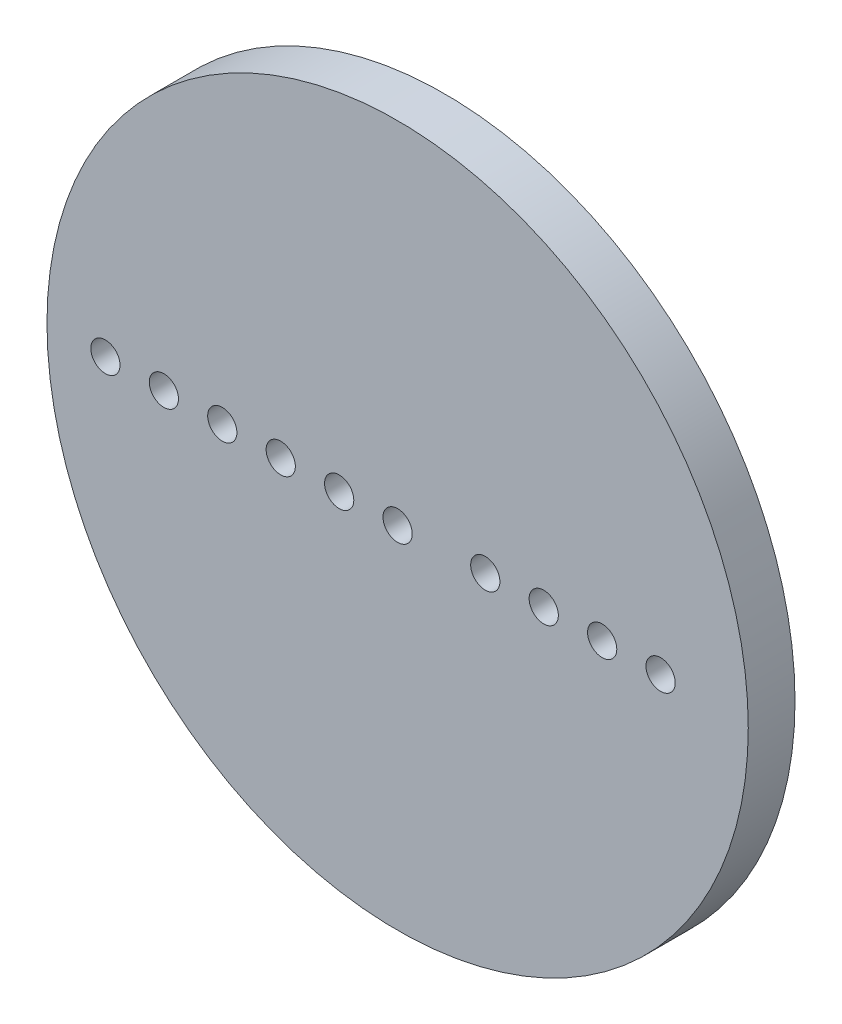
ISO-10303-21;
HEADER;
FILE_DESCRIPTION(('STEP AP214'),'2;1');
FILE_NAME('part.step','',(''),(''),'','','');
FILE_SCHEMA(('AUTOMOTIVE_DESIGN { 1 0 10303 214 1 1 1 1 }'));
ENDSEC;
DATA;
#1=APPLICATION_CONTEXT('core data for automotive mechanical design processes');
#2=APPLICATION_PROTOCOL_DEFINITION('international standard','automotive_design',2000,#1);
#3=PRODUCT_CONTEXT('',#1,'mechanical');
#4=PRODUCT('Part','Part','',(#3));
#5=PRODUCT_RELATED_PRODUCT_CATEGORY('part','',(#4));
#6=PRODUCT_DEFINITION_FORMATION('','',#4);
#7=PRODUCT_DEFINITION_CONTEXT('part definition',#1,'design');
#8=PRODUCT_DEFINITION('design','',#6,#7);
#9=PRODUCT_DEFINITION_SHAPE('','',#8);
#10=(LENGTH_UNIT() NAMED_UNIT(*) SI_UNIT(.MILLI.,.METRE.));
#11=(NAMED_UNIT(*) PLANE_ANGLE_UNIT() SI_UNIT($,.RADIAN.));
#12=(NAMED_UNIT(*) SI_UNIT($,.STERADIAN.) SOLID_ANGLE_UNIT());
#13=UNCERTAINTY_MEASURE_WITH_UNIT(LENGTH_MEASURE(1.E-05),#10,'distance_accuracy_value','');
#14=(GEOMETRIC_REPRESENTATION_CONTEXT(3) GLOBAL_UNCERTAINTY_ASSIGNED_CONTEXT((#13)) GLOBAL_UNIT_ASSIGNED_CONTEXT((#10,
#11,#12)) REPRESENTATION_CONTEXT('',''));
#15=CARTESIAN_POINT('',(0.,0.,0.));
#16=DIRECTION('',(0.,0.,1.));
#17=DIRECTION('',(1.,0.,0.));
#18=AXIS2_PLACEMENT_3D('',#15,#16,#17);
#19=CARTESIAN_POINT('',(0.,0.,4.));
#20=DIRECTION('',(0.,0.,1.));
#21=DIRECTION('',(1.,0.,0.));
#22=AXIS2_PLACEMENT_3D('',#19,#20,#21);
#23=PLANE('',#22);
#24=CARTESIAN_POINT('',(25.,0.419447227616765,4.));
#25=DIRECTION('',(0.,0.,1.));
#26=DIRECTION('',(1.,0.,0.));
#27=AXIS2_PLACEMENT_3D('',#24,#25,#26);
#28=CIRCLE('',#27,2.5);
#29=CARTESIAN_POINT('',(27.5,0.419447227616765,4.));
#30=VERTEX_POINT('',#29);
#31=EDGE_CURVE('E95',#30,#30,#28,.T.);
#32=ORIENTED_EDGE('',*,*,#31,.F.);
#33=EDGE_LOOP('',(#32));
#34=FACE_BOUND('',#33,.T.);
#35=CARTESIAN_POINT('',(45.,0.41944722761677,4.));
#36=DIRECTION('',(0.,0.,1.));
#37=DIRECTION('',(1.,0.,0.));
#38=AXIS2_PLACEMENT_3D('',#35,#36,#37);
#39=CIRCLE('',#38,2.49999999999999);
#40=CARTESIAN_POINT('',(47.5,0.41944722761677,4.));
#41=VERTEX_POINT('',#40);
#42=EDGE_CURVE('E83',#41,#41,#39,.T.);
#43=ORIENTED_EDGE('',*,*,#42,.F.);
#44=EDGE_LOOP('',(#43));
#45=FACE_BOUND('',#44,.T.);
#46=CARTESIAN_POINT('',(-40.,0.,4.));
#47=DIRECTION('',(0.,0.,1.));
#48=DIRECTION('',(1.,0.,0.));
#49=AXIS2_PLACEMENT_3D('',#46,#47,#48);
#50=CIRCLE('',#49,2.5);
#51=CARTESIAN_POINT('',(-37.5,0.,4.));
#52=VERTEX_POINT('',#51);
#53=EDGE_CURVE('E71',#52,#52,#50,.T.);
#54=ORIENTED_EDGE('',*,*,#53,.F.);
#55=EDGE_LOOP('',(#54));
#56=FACE_BOUND('',#55,.T.);
#57=CARTESIAN_POINT('',(-20.,0.,4.));
#58=DIRECTION('',(0.,0.,1.));
#59=DIRECTION('',(1.,0.,0.));
#60=AXIS2_PLACEMENT_3D('',#57,#58,#59);
#61=CIRCLE('',#60,2.5);
#62=CARTESIAN_POINT('',(-17.5,0.,4.));
#63=VERTEX_POINT('',#62);
#64=EDGE_CURVE('E59',#63,#63,#61,.T.);
#65=ORIENTED_EDGE('',*,*,#64,.F.);
#66=EDGE_LOOP('',(#65));
#67=FACE_BOUND('',#66,.T.);
#68=CARTESIAN_POINT('',(0.,0.,4.));
#69=DIRECTION('',(0.,0.,1.));
#70=DIRECTION('',(1.,0.,0.));
#71=AXIS2_PLACEMENT_3D('',#68,#69,#70);
#72=CIRCLE('',#71,2.5);
#73=CARTESIAN_POINT('',(2.5,0.,4.));
#74=VERTEX_POINT('',#73);
#75=EDGE_CURVE('E48',#74,#74,#72,.T.);
#76=ORIENTED_EDGE('',*,*,#75,.F.);
#77=EDGE_LOOP('',(#76));
#78=FACE_BOUND('',#77,.T.);
#79=CARTESIAN_POINT('',(0.,0.,4.));
#80=DIRECTION('',(0.,0.,1.));
#81=DIRECTION('',(1.,0.,0.));
#82=AXIS2_PLACEMENT_3D('',#79,#80,#81);
#83=CIRCLE('',#82,60.);
#84=CARTESIAN_POINT('',(60.,0.,4.));
#85=VERTEX_POINT('',#84);
#86=EDGE_CURVE('E10',#85,#85,#83,.T.);
#87=ORIENTED_EDGE('',*,*,#86,.T.);
#88=EDGE_LOOP('',(#87));
#89=FACE_BOUND('',#88,.T.);
#90=CARTESIAN_POINT('',(-10.,0.,4.));
#91=DIRECTION('',(0.,0.,1.));
#92=DIRECTION('',(1.,0.,0.));
#93=AXIS2_PLACEMENT_3D('',#90,#91,#92);
#94=CIRCLE('',#93,2.5);
#95=CARTESIAN_POINT('',(-7.5,0.,4.));
#96=VERTEX_POINT('',#95);
#97=EDGE_CURVE('E53',#96,#96,#94,.T.);
#98=ORIENTED_EDGE('',*,*,#97,.F.);
#99=EDGE_LOOP('',(#98));
#100=FACE_BOUND('',#99,.T.);
#101=CARTESIAN_POINT('',(-30.,0.,4.));
#102=DIRECTION('',(0.,0.,1.));
#103=DIRECTION('',(1.,0.,0.));
#104=AXIS2_PLACEMENT_3D('',#101,#102,#103);
#105=CIRCLE('',#104,2.5);
#106=CARTESIAN_POINT('',(-27.5,0.,4.));
#107=VERTEX_POINT('',#106);
#108=EDGE_CURVE('E65',#107,#107,#105,.T.);
#109=ORIENTED_EDGE('',*,*,#108,.F.);
#110=EDGE_LOOP('',(#109));
#111=FACE_BOUND('',#110,.T.);
#112=CARTESIAN_POINT('',(-50.,0.,4.));
#113=DIRECTION('',(0.,0.,1.));
#114=DIRECTION('',(1.,0.,0.));
#115=AXIS2_PLACEMENT_3D('',#112,#113,#114);
#116=CIRCLE('',#115,2.5);
#117=CARTESIAN_POINT('',(-47.5,0.,4.));
#118=VERTEX_POINT('',#117);
#119=EDGE_CURVE('E77',#118,#118,#116,.T.);
#120=ORIENTED_EDGE('',*,*,#119,.F.);
#121=EDGE_LOOP('',(#120));
#122=FACE_BOUND('',#121,.T.);
#123=CARTESIAN_POINT('',(35.,0.419447227616767,4.));
#124=DIRECTION('',(0.,0.,1.));
#125=DIRECTION('',(1.,0.,0.));
#126=AXIS2_PLACEMENT_3D('',#123,#124,#125);
#127=CIRCLE('',#126,2.5);
#128=CARTESIAN_POINT('',(37.5,0.419447227616767,4.));
#129=VERTEX_POINT('',#128);
#130=EDGE_CURVE('E89',#129,#129,#127,.T.);
#131=ORIENTED_EDGE('',*,*,#130,.F.);
#132=EDGE_LOOP('',(#131));
#133=FACE_BOUND('',#132,.T.);
#134=CARTESIAN_POINT('',(15.,0.419447227616763,4.));
#135=DIRECTION('',(0.,0.,1.));
#136=DIRECTION('',(1.,0.,0.));
#137=AXIS2_PLACEMENT_3D('',#134,#135,#136);
#138=CIRCLE('',#137,2.50000000000001);
#139=CARTESIAN_POINT('',(17.5,0.419447227616763,4.));
#140=VERTEX_POINT('',#139);
#141=EDGE_CURVE('E101',#140,#140,#138,.T.);
#142=ORIENTED_EDGE('',*,*,#141,.F.);
#143=EDGE_LOOP('',(#142));
#144=FACE_BOUND('',#143,.T.);
#145=ADVANCED_FACE('F37',(#34,#45,#56,#67,#78,#89,#100,#111,#122,#133,#144),#23,.T.);
#146=CARTESIAN_POINT('',(0.,0.,-4.));
#147=DIRECTION('',(0.,0.,1.));
#148=DIRECTION('',(1.,0.,0.));
#149=AXIS2_PLACEMENT_3D('',#146,#147,#148);
#150=PLANE('',#149);
#151=CARTESIAN_POINT('',(0.,0.,-4.));
#152=DIRECTION('',(0.,0.,1.));
#153=DIRECTION('',(1.,0.,0.));
#154=AXIS2_PLACEMENT_3D('',#151,#152,#153);
#155=CIRCLE('',#154,60.);
#156=CARTESIAN_POINT('',(60.,0.,-4.));
#157=VERTEX_POINT('',#156);
#158=EDGE_CURVE('E41',#157,#157,#155,.T.);
#159=ORIENTED_EDGE('',*,*,#158,.F.);
#160=EDGE_LOOP('',(#159));
#161=FACE_BOUND('',#160,.T.);
#162=CARTESIAN_POINT('',(0.,0.,-4.));
#163=DIRECTION('',(0.,0.,1.));
#164=DIRECTION('',(1.,0.,0.));
#165=AXIS2_PLACEMENT_3D('',#162,#163,#164);
#166=CIRCLE('',#165,2.5);
#167=CARTESIAN_POINT('',(2.5,0.,-4.));
#168=VERTEX_POINT('',#167);
#169=EDGE_CURVE('E50',#168,#168,#166,.T.);
#170=ORIENTED_EDGE('',*,*,#169,.T.);
#171=EDGE_LOOP('',(#170));
#172=FACE_BOUND('',#171,.T.);
#173=CARTESIAN_POINT('',(-10.,0.,-4.));
#174=DIRECTION('',(0.,0.,1.));
#175=DIRECTION('',(1.,0.,0.));
#176=AXIS2_PLACEMENT_3D('',#173,#174,#175);
#177=CIRCLE('',#176,2.5);
#178=CARTESIAN_POINT('',(-7.5,0.,-4.));
#179=VERTEX_POINT('',#178);
#180=EDGE_CURVE('E56',#179,#179,#177,.T.);
#181=ORIENTED_EDGE('',*,*,#180,.T.);
#182=EDGE_LOOP('',(#181));
#183=FACE_BOUND('',#182,.T.);
#184=CARTESIAN_POINT('',(-20.,0.,-4.));
#185=DIRECTION('',(0.,0.,1.));
#186=DIRECTION('',(1.,0.,0.));
#187=AXIS2_PLACEMENT_3D('',#184,#185,#186);
#188=CIRCLE('',#187,2.5);
#189=CARTESIAN_POINT('',(-17.5,0.,-4.));
#190=VERTEX_POINT('',#189);
#191=EDGE_CURVE('E62',#190,#190,#188,.T.);
#192=ORIENTED_EDGE('',*,*,#191,.T.);
#193=EDGE_LOOP('',(#192));
#194=FACE_BOUND('',#193,.T.);
#195=CARTESIAN_POINT('',(-30.,0.,-4.));
#196=DIRECTION('',(0.,0.,1.));
#197=DIRECTION('',(1.,0.,0.));
#198=AXIS2_PLACEMENT_3D('',#195,#196,#197);
#199=CIRCLE('',#198,2.5);
#200=CARTESIAN_POINT('',(-27.5,0.,-4.));
#201=VERTEX_POINT('',#200);
#202=EDGE_CURVE('E68',#201,#201,#199,.T.);
#203=ORIENTED_EDGE('',*,*,#202,.T.);
#204=EDGE_LOOP('',(#203));
#205=FACE_BOUND('',#204,.T.);
#206=CARTESIAN_POINT('',(-40.,0.,-4.));
#207=DIRECTION('',(0.,0.,1.));
#208=DIRECTION('',(1.,0.,0.));
#209=AXIS2_PLACEMENT_3D('',#206,#207,#208);
#210=CIRCLE('',#209,2.5);
#211=CARTESIAN_POINT('',(-37.5,0.,-4.));
#212=VERTEX_POINT('',#211);
#213=EDGE_CURVE('E74',#212,#212,#210,.T.);
#214=ORIENTED_EDGE('',*,*,#213,.T.);
#215=EDGE_LOOP('',(#214));
#216=FACE_BOUND('',#215,.T.);
#217=CARTESIAN_POINT('',(-50.,0.,-4.));
#218=DIRECTION('',(0.,0.,1.));
#219=DIRECTION('',(1.,0.,0.));
#220=AXIS2_PLACEMENT_3D('',#217,#218,#219);
#221=CIRCLE('',#220,2.5);
#222=CARTESIAN_POINT('',(-47.5,0.,-4.));
#223=VERTEX_POINT('',#222);
#224=EDGE_CURVE('E80',#223,#223,#221,.T.);
#225=ORIENTED_EDGE('',*,*,#224,.T.);
#226=EDGE_LOOP('',(#225));
#227=FACE_BOUND('',#226,.T.);
#228=CARTESIAN_POINT('',(45.,0.41944722761677,-4.));
#229=DIRECTION('',(0.,0.,1.));
#230=DIRECTION('',(1.,0.,0.));
#231=AXIS2_PLACEMENT_3D('',#228,#229,#230);
#232=CIRCLE('',#231,2.49999999999999);
#233=CARTESIAN_POINT('',(47.5,0.41944722761677,-4.));
#234=VERTEX_POINT('',#233);
#235=EDGE_CURVE('E86',#234,#234,#232,.T.);
#236=ORIENTED_EDGE('',*,*,#235,.T.);
#237=EDGE_LOOP('',(#236));
#238=FACE_BOUND('',#237,.T.);
#239=CARTESIAN_POINT('',(35.,0.419447227616767,-4.));
#240=DIRECTION('',(0.,0.,1.));
#241=DIRECTION('',(1.,0.,0.));
#242=AXIS2_PLACEMENT_3D('',#239,#240,#241);
#243=CIRCLE('',#242,2.5);
#244=CARTESIAN_POINT('',(37.5,0.419447227616767,-4.));
#245=VERTEX_POINT('',#244);
#246=EDGE_CURVE('E92',#245,#245,#243,.T.);
#247=ORIENTED_EDGE('',*,*,#246,.T.);
#248=EDGE_LOOP('',(#247));
#249=FACE_BOUND('',#248,.T.);
#250=CARTESIAN_POINT('',(25.,0.419447227616765,-4.));
#251=DIRECTION('',(0.,0.,1.));
#252=DIRECTION('',(1.,0.,0.));
#253=AXIS2_PLACEMENT_3D('',#250,#251,#252);
#254=CIRCLE('',#253,2.5);
#255=CARTESIAN_POINT('',(27.5,0.419447227616765,-4.));
#256=VERTEX_POINT('',#255);
#257=EDGE_CURVE('E98',#256,#256,#254,.T.);
#258=ORIENTED_EDGE('',*,*,#257,.T.);
#259=EDGE_LOOP('',(#258));
#260=FACE_BOUND('',#259,.T.);
#261=CARTESIAN_POINT('',(15.,0.419447227616763,-4.));
#262=DIRECTION('',(0.,0.,1.));
#263=DIRECTION('',(1.,0.,0.));
#264=AXIS2_PLACEMENT_3D('',#261,#262,#263);
#265=CIRCLE('',#264,2.50000000000001);
#266=CARTESIAN_POINT('',(17.5,0.419447227616763,-4.));
#267=VERTEX_POINT('',#266);
#268=EDGE_CURVE('E104',#267,#267,#265,.T.);
#269=ORIENTED_EDGE('',*,*,#268,.T.);
#270=EDGE_LOOP('',(#269));
#271=FACE_BOUND('',#270,.T.);
#272=ADVANCED_FACE('F114',(#161,#172,#183,#194,#205,#216,#227,#238,#249,#260,#271),#150,.F.);
#273=CARTESIAN_POINT('',(0.,0.,4.));
#274=DIRECTION('',(0.,0.,-1.));
#275=DIRECTION('',(-1.,0.,0.));
#276=AXIS2_PLACEMENT_3D('',#273,#274,#275);
#277=CYLINDRICAL_SURFACE('',#276,60.);
#278=ORIENTED_EDGE('',*,*,#86,.F.);
#279=EDGE_LOOP('',(#278));
#280=FACE_BOUND('',#279,.T.);
#281=ORIENTED_EDGE('',*,*,#158,.T.);
#282=EDGE_LOOP('',(#281));
#283=FACE_BOUND('',#282,.T.);
#284=ADVANCED_FACE('F39',(#280,#283),#277,.T.);
#285=CARTESIAN_POINT('',(0.,0.,4.));
#286=DIRECTION('',(0.,0.,-1.));
#287=DIRECTION('',(-1.,0.,0.));
#288=AXIS2_PLACEMENT_3D('',#285,#286,#287);
#289=CYLINDRICAL_SURFACE('',#288,2.5);
#290=ORIENTED_EDGE('',*,*,#75,.T.);
#291=EDGE_LOOP('',(#290));
#292=FACE_BOUND('',#291,.T.);
#293=ORIENTED_EDGE('',*,*,#169,.F.);
#294=EDGE_LOOP('',(#293));
#295=FACE_BOUND('',#294,.T.);
#296=ADVANCED_FACE('F124',(#292,#295),#289,.F.);
#297=CARTESIAN_POINT('',(-10.,0.,4.));
#298=DIRECTION('',(0.,0.,-1.));
#299=DIRECTION('',(-1.,0.,0.));
#300=AXIS2_PLACEMENT_3D('',#297,#298,#299);
#301=CYLINDRICAL_SURFACE('',#300,2.5);
#302=ORIENTED_EDGE('',*,*,#97,.T.);
#303=EDGE_LOOP('',(#302));
#304=FACE_BOUND('',#303,.T.);
#305=ORIENTED_EDGE('',*,*,#180,.F.);
#306=EDGE_LOOP('',(#305));
#307=FACE_BOUND('',#306,.T.);
#308=ADVANCED_FACE('F127',(#304,#307),#301,.F.);
#309=CARTESIAN_POINT('',(-20.,0.,4.));
#310=DIRECTION('',(0.,0.,-1.));
#311=DIRECTION('',(-1.,0.,0.));
#312=AXIS2_PLACEMENT_3D('',#309,#310,#311);
#313=CYLINDRICAL_SURFACE('',#312,2.5);
#314=ORIENTED_EDGE('',*,*,#64,.T.);
#315=EDGE_LOOP('',(#314));
#316=FACE_BOUND('',#315,.T.);
#317=ORIENTED_EDGE('',*,*,#191,.F.);
#318=EDGE_LOOP('',(#317));
#319=FACE_BOUND('',#318,.T.);
#320=ADVANCED_FACE('F131',(#316,#319),#313,.F.);
#321=CARTESIAN_POINT('',(-30.,0.,4.));
#322=DIRECTION('',(0.,0.,-1.));
#323=DIRECTION('',(-1.,0.,0.));
#324=AXIS2_PLACEMENT_3D('',#321,#322,#323);
#325=CYLINDRICAL_SURFACE('',#324,2.5);
#326=ORIENTED_EDGE('',*,*,#108,.T.);
#327=EDGE_LOOP('',(#326));
#328=FACE_BOUND('',#327,.T.);
#329=ORIENTED_EDGE('',*,*,#202,.F.);
#330=EDGE_LOOP('',(#329));
#331=FACE_BOUND('',#330,.T.);
#332=ADVANCED_FACE('F135',(#328,#331),#325,.F.);
#333=CARTESIAN_POINT('',(-40.,0.,4.));
#334=DIRECTION('',(0.,0.,-1.));
#335=DIRECTION('',(-1.,0.,0.));
#336=AXIS2_PLACEMENT_3D('',#333,#334,#335);
#337=CYLINDRICAL_SURFACE('',#336,2.5);
#338=ORIENTED_EDGE('',*,*,#53,.T.);
#339=EDGE_LOOP('',(#338));
#340=FACE_BOUND('',#339,.T.);
#341=ORIENTED_EDGE('',*,*,#213,.F.);
#342=EDGE_LOOP('',(#341));
#343=FACE_BOUND('',#342,.T.);
#344=ADVANCED_FACE('F139',(#340,#343),#337,.F.);
#345=CARTESIAN_POINT('',(-50.,0.,4.));
#346=DIRECTION('',(0.,0.,-1.));
#347=DIRECTION('',(-1.,0.,0.));
#348=AXIS2_PLACEMENT_3D('',#345,#346,#347);
#349=CYLINDRICAL_SURFACE('',#348,2.5);
#350=ORIENTED_EDGE('',*,*,#119,.T.);
#351=EDGE_LOOP('',(#350));
#352=FACE_BOUND('',#351,.T.);
#353=ORIENTED_EDGE('',*,*,#224,.F.);
#354=EDGE_LOOP('',(#353));
#355=FACE_BOUND('',#354,.T.);
#356=ADVANCED_FACE('F143',(#352,#355),#349,.F.);
#357=CARTESIAN_POINT('',(45.,0.41944722761677,4.));
#358=DIRECTION('',(0.,0.,-1.));
#359=DIRECTION('',(-1.,0.,0.));
#360=AXIS2_PLACEMENT_3D('',#357,#358,#359);
#361=CYLINDRICAL_SURFACE('',#360,2.49999999999999);
#362=ORIENTED_EDGE('',*,*,#42,.T.);
#363=EDGE_LOOP('',(#362));
#364=FACE_BOUND('',#363,.T.);
#365=ORIENTED_EDGE('',*,*,#235,.F.);
#366=EDGE_LOOP('',(#365));
#367=FACE_BOUND('',#366,.T.);
#368=ADVANCED_FACE('F147',(#364,#367),#361,.F.);
#369=CARTESIAN_POINT('',(35.,0.419447227616767,4.));
#370=DIRECTION('',(0.,0.,-1.));
#371=DIRECTION('',(-1.,0.,0.));
#372=AXIS2_PLACEMENT_3D('',#369,#370,#371);
#373=CYLINDRICAL_SURFACE('',#372,2.5);
#374=ORIENTED_EDGE('',*,*,#130,.T.);
#375=EDGE_LOOP('',(#374));
#376=FACE_BOUND('',#375,.T.);
#377=ORIENTED_EDGE('',*,*,#246,.F.);
#378=EDGE_LOOP('',(#377));
#379=FACE_BOUND('',#378,.T.);
#380=ADVANCED_FACE('F151',(#376,#379),#373,.F.);
#381=CARTESIAN_POINT('',(25.,0.419447227616765,4.));
#382=DIRECTION('',(0.,0.,-1.));
#383=DIRECTION('',(-1.,0.,0.));
#384=AXIS2_PLACEMENT_3D('',#381,#382,#383);
#385=CYLINDRICAL_SURFACE('',#384,2.5);
#386=ORIENTED_EDGE('',*,*,#31,.T.);
#387=EDGE_LOOP('',(#386));
#388=FACE_BOUND('',#387,.T.);
#389=ORIENTED_EDGE('',*,*,#257,.F.);
#390=EDGE_LOOP('',(#389));
#391=FACE_BOUND('',#390,.T.);
#392=ADVANCED_FACE('F155',(#388,#391),#385,.F.);
#393=CARTESIAN_POINT('',(15.,0.419447227616763,4.));
#394=DIRECTION('',(0.,0.,-1.));
#395=DIRECTION('',(-1.,0.,0.));
#396=AXIS2_PLACEMENT_3D('',#393,#394,#395);
#397=CYLINDRICAL_SURFACE('',#396,2.50000000000001);
#398=ORIENTED_EDGE('',*,*,#141,.T.);
#399=EDGE_LOOP('',(#398));
#400=FACE_BOUND('',#399,.T.);
#401=ORIENTED_EDGE('',*,*,#268,.F.);
#402=EDGE_LOOP('',(#401));
#403=FACE_BOUND('',#402,.T.);
#404=ADVANCED_FACE('F110',(#400,#403),#397,.F.);
#405=CLOSED_SHELL('',(#145,#272,#284,#296,#308,#320,#332,#344,#356,#368,#380,#392,#404));
#406=MANIFOLD_SOLID_BREP('B2',#405);
#407=ADVANCED_BREP_SHAPE_REPRESENTATION('',(#18,#406),#14);
#408=SHAPE_DEFINITION_REPRESENTATION(#9,#407);
ENDSEC;
END-ISO-10303-21;
